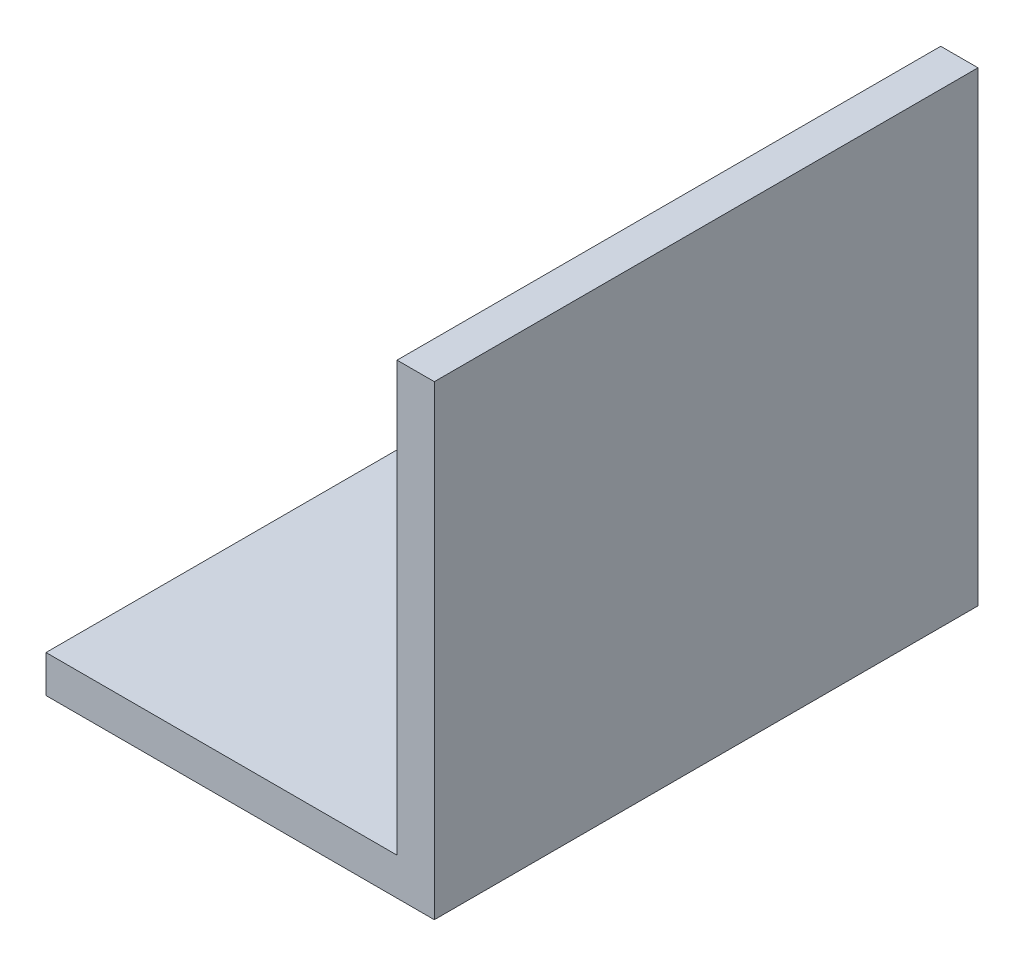
ISO-10303-21;
HEADER;
FILE_DESCRIPTION(('STEP AP214'),'2;1');
FILE_NAME('part.step','',(''),(''),'','','');
FILE_SCHEMA(('AUTOMOTIVE_DESIGN { 1 0 10303 214 1 1 1 1 }'));
ENDSEC;
DATA;
#1=APPLICATION_CONTEXT('core data for automotive mechanical design processes');
#2=APPLICATION_PROTOCOL_DEFINITION('international standard','automotive_design',2000,#1);
#3=PRODUCT_CONTEXT('',#1,'mechanical');
#4=PRODUCT('Part','Part','',(#3));
#5=PRODUCT_RELATED_PRODUCT_CATEGORY('part','',(#4));
#6=PRODUCT_DEFINITION_FORMATION('','',#4);
#7=PRODUCT_DEFINITION_CONTEXT('part definition',#1,'design');
#8=PRODUCT_DEFINITION('design','',#6,#7);
#9=PRODUCT_DEFINITION_SHAPE('','',#8);
#10=(LENGTH_UNIT() NAMED_UNIT(*) SI_UNIT(.MILLI.,.METRE.));
#11=(NAMED_UNIT(*) PLANE_ANGLE_UNIT() SI_UNIT($,.RADIAN.));
#12=(NAMED_UNIT(*) SI_UNIT($,.STERADIAN.) SOLID_ANGLE_UNIT());
#13=UNCERTAINTY_MEASURE_WITH_UNIT(LENGTH_MEASURE(1.E-05),#10,'distance_accuracy_value','');
#14=(GEOMETRIC_REPRESENTATION_CONTEXT(3) GLOBAL_UNCERTAINTY_ASSIGNED_CONTEXT((#13)) GLOBAL_UNIT_ASSIGNED_CONTEXT((#10,
#11,#12)) REPRESENTATION_CONTEXT('',''));
#15=CARTESIAN_POINT('',(0.,0.,0.));
#16=DIRECTION('',(0.,0.,1.));
#17=DIRECTION('',(1.,0.,0.));
#18=AXIS2_PLACEMENT_3D('',#15,#16,#17);
#19=CARTESIAN_POINT('',(-14.351,0.,11.1125));
#20=DIRECTION('',(1.,0.,0.));
#21=DIRECTION('',(0.,0.,-1.));
#22=AXIS2_PLACEMENT_3D('',#19,#20,#21);
#23=PLANE('',#22);
#24=DIRECTION('',(0.,-1.,0.));
#25=VECTOR('',#24,1.);
#26=CARTESIAN_POINT('',(-14.351,0.,-11.1125));
#27=LINE('',#26,#25);
#28=CARTESIAN_POINT('',(-14.351,0.,-11.1125));
#29=VERTEX_POINT('',#28);
#30=CARTESIAN_POINT('',(-14.351,-1.524,-11.1125));
#31=VERTEX_POINT('',#30);
#32=EDGE_CURVE('E119',#29,#31,#27,.T.);
#33=ORIENTED_EDGE('',*,*,#32,.T.);
#34=DIRECTION('',(0.,0.,-1.));
#35=VECTOR('',#34,1.);
#36=CARTESIAN_POINT('',(-14.351,-1.524,11.1125));
#37=LINE('',#36,#35);
#38=CARTESIAN_POINT('',(-14.351,-1.524,11.1125));
#39=VERTEX_POINT('',#38);
#40=EDGE_CURVE('E11',#39,#31,#37,.T.);
#41=ORIENTED_EDGE('',*,*,#40,.F.);
#42=DIRECTION('',(0.,-1.,0.));
#43=VECTOR('',#42,1.);
#44=CARTESIAN_POINT('',(-14.351,0.,11.1125));
#45=LINE('',#44,#43);
#46=CARTESIAN_POINT('',(-14.351,0.,11.1125));
#47=VERTEX_POINT('',#46);
#48=EDGE_CURVE('E130',#47,#39,#45,.T.);
#49=ORIENTED_EDGE('',*,*,#48,.F.);
#50=DIRECTION('',(0.,0.,-1.));
#51=VECTOR('',#50,1.);
#52=CARTESIAN_POINT('',(-14.351,0.,11.1125));
#53=LINE('',#52,#51);
#54=EDGE_CURVE('E115',#47,#29,#53,.T.);
#55=ORIENTED_EDGE('',*,*,#54,.T.);
#56=EDGE_LOOP('',(#33,#41,#49,#55));
#57=FACE_BOUND('',#56,.T.);
#58=ADVANCED_FACE('F35',(#57),#23,.F.);
#59=CARTESIAN_POINT('',(-14.351,-1.524,11.1125));
#60=DIRECTION('',(0.,1.,0.));
#61=DIRECTION('',(0.,0.,1.));
#62=AXIS2_PLACEMENT_3D('',#59,#60,#61);
#63=PLANE('',#62);
#64=CARTESIAN_POINT('',(-7.1755,-1.524,0.));
#65=DIRECTION('',(0.,1.,0.));
#66=DIRECTION('',(0.,0.,1.));
#67=AXIS2_PLACEMENT_3D('',#64,#65,#66);
#68=CIRCLE('',#67,2.24789999999999);
#69=CARTESIAN_POINT('',(-7.1755,-1.524,2.24789999999999));
#70=VERTEX_POINT('',#69);
#71=EDGE_CURVE('E123',#70,#70,#68,.T.);
#72=ORIENTED_EDGE('',*,*,#71,.T.);
#73=EDGE_LOOP('',(#72));
#74=FACE_BOUND('',#73,.T.);
#75=DIRECTION('',(1.,0.,0.));
#76=VECTOR('',#75,1.);
#77=CARTESIAN_POINT('',(-14.351,-1.524,-11.1125));
#78=LINE('',#77,#76);
#79=CARTESIAN_POINT('',(1.524,-1.524,-11.1125));
#80=VERTEX_POINT('',#79);
#81=EDGE_CURVE('E122',#31,#80,#78,.T.);
#82=ORIENTED_EDGE('',*,*,#81,.T.);
#83=DIRECTION('',(0.,0.,-1.));
#84=VECTOR('',#83,1.);
#85=CARTESIAN_POINT('',(1.524,-1.524,11.1125));
#86=LINE('',#85,#84);
#87=CARTESIAN_POINT('',(1.524,-1.524,11.1125));
#88=VERTEX_POINT('',#87);
#89=EDGE_CURVE('E43',#88,#80,#86,.T.);
#90=ORIENTED_EDGE('',*,*,#89,.F.);
#91=DIRECTION('',(1.,0.,0.));
#92=VECTOR('',#91,1.);
#93=CARTESIAN_POINT('',(-14.351,-1.524,11.1125));
#94=LINE('',#93,#92);
#95=EDGE_CURVE('E88',#39,#88,#94,.T.);
#96=ORIENTED_EDGE('',*,*,#95,.F.);
#97=ORIENTED_EDGE('',*,*,#40,.T.);
#98=EDGE_LOOP('',(#82,#90,#96,#97));
#99=FACE_BOUND('',#98,.T.);
#100=ADVANCED_FACE('F156',(#74,#99),#63,.F.);
#101=CARTESIAN_POINT('',(1.524,-1.524,11.1125));
#102=DIRECTION('',(-1.,0.,0.));
#103=DIRECTION('',(0.,-1.,0.));
#104=AXIS2_PLACEMENT_3D('',#101,#102,#103);
#105=PLANE('',#104);
#106=DIRECTION('',(0.,1.,0.));
#107=VECTOR('',#106,1.);
#108=CARTESIAN_POINT('',(1.524,-1.524,-11.1125));
#109=LINE('',#108,#107);
#110=CARTESIAN_POINT('',(1.524,17.526,-11.1125));
#111=VERTEX_POINT('',#110);
#112=EDGE_CURVE('E125',#80,#111,#109,.T.);
#113=ORIENTED_EDGE('',*,*,#112,.T.);
#114=DIRECTION('',(0.,0.,-1.));
#115=VECTOR('',#114,1.);
#116=CARTESIAN_POINT('',(1.524,17.526,11.1125));
#117=LINE('',#116,#115);
#118=CARTESIAN_POINT('',(1.524,17.526,11.1125));
#119=VERTEX_POINT('',#118);
#120=EDGE_CURVE('E110',#119,#111,#117,.T.);
#121=ORIENTED_EDGE('',*,*,#120,.F.);
#122=DIRECTION('',(0.,1.,0.));
#123=VECTOR('',#122,1.);
#124=CARTESIAN_POINT('',(1.524,-1.524,11.1125));
#125=LINE('',#124,#123);
#126=EDGE_CURVE('E101',#88,#119,#125,.T.);
#127=ORIENTED_EDGE('',*,*,#126,.F.);
#128=ORIENTED_EDGE('',*,*,#89,.T.);
#129=EDGE_LOOP('',(#113,#121,#127,#128));
#130=FACE_BOUND('',#129,.T.);
#131=ADVANCED_FACE('F136',(#130),#105,.F.);
#132=CARTESIAN_POINT('',(1.524,17.526,11.1125));
#133=DIRECTION('',(0.,-1.,0.));
#134=DIRECTION('',(1.,0.,0.));
#135=AXIS2_PLACEMENT_3D('',#132,#133,#134);
#136=PLANE('',#135);
#137=DIRECTION('',(-1.,0.,0.));
#138=VECTOR('',#137,1.);
#139=CARTESIAN_POINT('',(1.524,17.526,-11.1125));
#140=LINE('',#139,#138);
#141=CARTESIAN_POINT('',(0.,17.526,-11.1125));
#142=VERTEX_POINT('',#141);
#143=EDGE_CURVE('E109',#111,#142,#140,.T.);
#144=ORIENTED_EDGE('',*,*,#143,.T.);
#145=DIRECTION('',(0.,0.,-1.));
#146=VECTOR('',#145,1.);
#147=CARTESIAN_POINT('',(0.,17.526,11.1125));
#148=LINE('',#147,#146);
#149=CARTESIAN_POINT('',(0.,17.526,11.1125));
#150=VERTEX_POINT('',#149);
#151=EDGE_CURVE('E106',#150,#142,#148,.T.);
#152=ORIENTED_EDGE('',*,*,#151,.F.);
#153=DIRECTION('',(-1.,0.,0.));
#154=VECTOR('',#153,1.);
#155=CARTESIAN_POINT('',(1.524,17.526,11.1125));
#156=LINE('',#155,#154);
#157=EDGE_CURVE('E95',#119,#150,#156,.T.);
#158=ORIENTED_EDGE('',*,*,#157,.F.);
#159=ORIENTED_EDGE('',*,*,#120,.T.);
#160=EDGE_LOOP('',(#144,#152,#158,#159));
#161=FACE_BOUND('',#160,.T.);
#162=ADVANCED_FACE('F107',(#161),#136,.F.);
#163=CARTESIAN_POINT('',(0.,0.,11.1125));
#164=DIRECTION('',(1.,0.,0.));
#165=DIRECTION('',(0.,1.,0.));
#166=AXIS2_PLACEMENT_3D('',#163,#164,#165);
#167=PLANE('',#166);
#168=DIRECTION('',(0.,-1.,0.));
#169=VECTOR('',#168,1.);
#170=CARTESIAN_POINT('',(0.,0.,-11.1125));
#171=LINE('',#170,#169);
#172=CARTESIAN_POINT('',(0.,0.,-11.1125));
#173=VERTEX_POINT('',#172);
#174=EDGE_CURVE('E74',#142,#173,#171,.T.);
#175=ORIENTED_EDGE('',*,*,#174,.T.);
#176=DIRECTION('',(0.,0.,-1.));
#177=VECTOR('',#176,1.);
#178=CARTESIAN_POINT('',(0.,0.,11.1125));
#179=LINE('',#178,#177);
#180=CARTESIAN_POINT('',(0.,0.,11.1125));
#181=VERTEX_POINT('',#180);
#182=EDGE_CURVE('E111',#181,#173,#179,.T.);
#183=ORIENTED_EDGE('',*,*,#182,.F.);
#184=DIRECTION('',(0.,-1.,0.));
#185=VECTOR('',#184,1.);
#186=CARTESIAN_POINT('',(0.,0.,11.1125));
#187=LINE('',#186,#185);
#188=EDGE_CURVE('E99',#150,#181,#187,.T.);
#189=ORIENTED_EDGE('',*,*,#188,.F.);
#190=ORIENTED_EDGE('',*,*,#151,.T.);
#191=EDGE_LOOP('',(#175,#183,#189,#190));
#192=FACE_BOUND('',#191,.T.);
#193=ADVANCED_FACE('F113',(#192),#167,.F.);
#194=CARTESIAN_POINT('',(-14.351,0.,11.1125));
#195=DIRECTION('',(0.,-1.,0.));
#196=DIRECTION('',(0.,0.,-1.));
#197=AXIS2_PLACEMENT_3D('',#194,#195,#196);
#198=PLANE('',#197);
#199=CARTESIAN_POINT('',(-7.1755,0.,0.));
#200=DIRECTION('',(0.,1.,0.));
#201=DIRECTION('',(0.,0.,1.));
#202=AXIS2_PLACEMENT_3D('',#199,#200,#201);
#203=CIRCLE('',#202,2.2479);
#204=CARTESIAN_POINT('',(-7.1755,0.,2.24789999999999));
#205=VERTEX_POINT('',#204);
#206=EDGE_CURVE('E215',#205,#205,#203,.T.);
#207=ORIENTED_EDGE('',*,*,#206,.F.);
#208=EDGE_LOOP('',(#207));
#209=FACE_BOUND('',#208,.T.);
#210=DIRECTION('',(-1.,0.,0.));
#211=VECTOR('',#210,1.);
#212=CARTESIAN_POINT('',(-14.351,0.,-11.1125));
#213=LINE('',#212,#211);
#214=EDGE_CURVE('E80',#173,#29,#213,.T.);
#215=ORIENTED_EDGE('',*,*,#214,.T.);
#216=ORIENTED_EDGE('',*,*,#54,.F.);
#217=DIRECTION('',(-1.,0.,0.));
#218=VECTOR('',#217,1.);
#219=CARTESIAN_POINT('',(-14.351,0.,11.1125));
#220=LINE('',#219,#218);
#221=EDGE_CURVE('E51',#181,#47,#220,.T.);
#222=ORIENTED_EDGE('',*,*,#221,.F.);
#223=ORIENTED_EDGE('',*,*,#182,.T.);
#224=EDGE_LOOP('',(#215,#216,#222,#223));
#225=FACE_BOUND('',#224,.T.);
#226=ADVANCED_FACE('F143',(#209,#225),#198,.F.);
#227=CARTESIAN_POINT('',(0.,0.,11.1125));
#228=DIRECTION('',(0.,0.,1.));
#229=DIRECTION('',(1.,0.,0.));
#230=AXIS2_PLACEMENT_3D('',#227,#228,#229);
#231=PLANE('',#230);
#232=ORIENTED_EDGE('',*,*,#48,.T.);
#233=ORIENTED_EDGE('',*,*,#95,.T.);
#234=ORIENTED_EDGE('',*,*,#126,.T.);
#235=ORIENTED_EDGE('',*,*,#157,.T.);
#236=ORIENTED_EDGE('',*,*,#188,.T.);
#237=ORIENTED_EDGE('',*,*,#221,.T.);
#238=EDGE_LOOP('',(#232,#233,#234,#235,#236,#237));
#239=FACE_BOUND('',#238,.T.);
#240=ADVANCED_FACE('F97',(#239),#231,.T.);
#241=CARTESIAN_POINT('',(0.,0.,-11.1125));
#242=DIRECTION('',(0.,0.,1.));
#243=DIRECTION('',(1.,0.,0.));
#244=AXIS2_PLACEMENT_3D('',#241,#242,#243);
#245=PLANE('',#244);
#246=ORIENTED_EDGE('',*,*,#32,.F.);
#247=ORIENTED_EDGE('',*,*,#214,.F.);
#248=ORIENTED_EDGE('',*,*,#174,.F.);
#249=ORIENTED_EDGE('',*,*,#143,.F.);
#250=ORIENTED_EDGE('',*,*,#112,.F.);
#251=ORIENTED_EDGE('',*,*,#81,.F.);
#252=EDGE_LOOP('',(#246,#247,#248,#249,#250,#251));
#253=FACE_BOUND('',#252,.T.);
#254=ADVANCED_FACE('F139',(#253),#245,.F.);
#255=CARTESIAN_POINT('',(-7.1755,0.,0.));
#256=DIRECTION('',(0.,1.,0.));
#257=DIRECTION('',(0.,0.,1.));
#258=AXIS2_PLACEMENT_3D('',#255,#256,#257);
#259=CYLINDRICAL_SURFACE('',#258,2.24789999999999);
#260=ORIENTED_EDGE('',*,*,#206,.T.);
#261=EDGE_LOOP('',(#260));
#262=FACE_BOUND('',#261,.T.);
#263=ORIENTED_EDGE('',*,*,#71,.F.);
#264=EDGE_LOOP('',(#263));
#265=FACE_BOUND('',#264,.T.);
#266=ADVANCED_FACE('F191',(#262,#265),#259,.F.);
#267=CLOSED_SHELL('',(#58,#100,#131,#162,#193,#226,#240,#254,#266));
#268=MANIFOLD_SOLID_BREP('B2',#267);
#269=ADVANCED_BREP_SHAPE_REPRESENTATION('',(#18,#268),#14);
#270=SHAPE_DEFINITION_REPRESENTATION(#9,#269);
ENDSEC;
END-ISO-10303-21;
